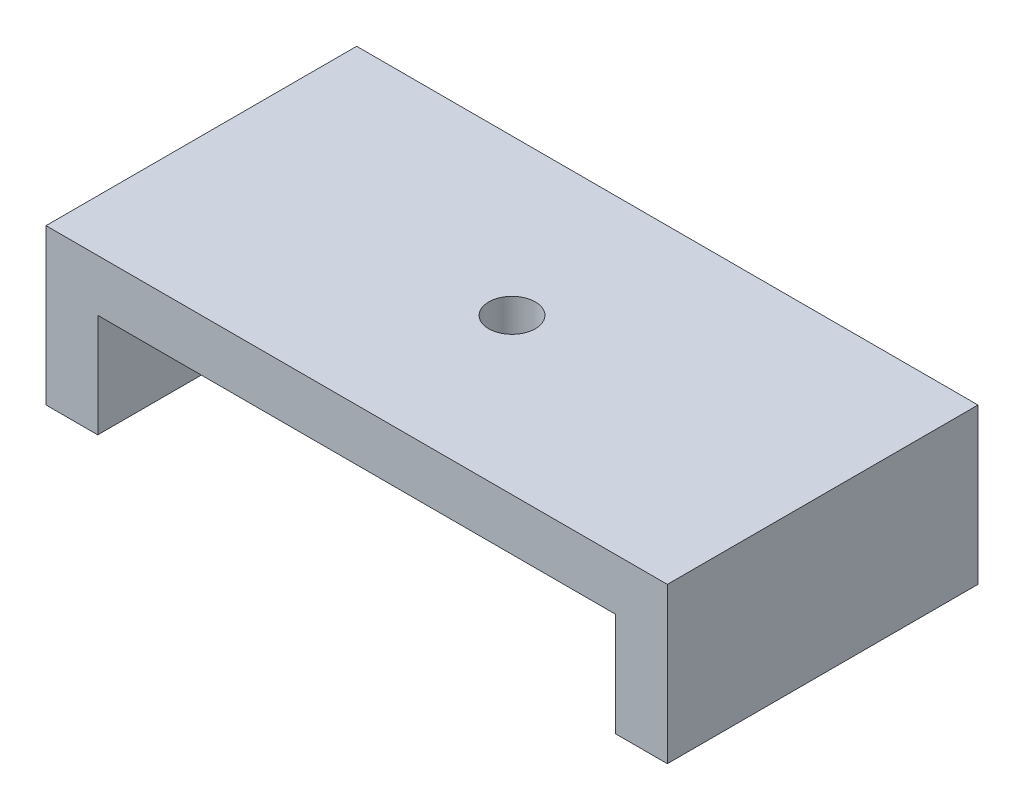
ISO-10303-21;
HEADER;
FILE_DESCRIPTION(('STEP AP214'),'2;1');
FILE_NAME('part.step','',(''),(''),'','','');
FILE_SCHEMA(('AUTOMOTIVE_DESIGN { 1 0 10303 214 1 1 1 1 }'));
ENDSEC;
DATA;
#1=APPLICATION_CONTEXT('core data for automotive mechanical design processes');
#2=APPLICATION_PROTOCOL_DEFINITION('international standard','automotive_design',2000,#1);
#3=PRODUCT_CONTEXT('',#1,'mechanical');
#4=PRODUCT('Part','Part','',(#3));
#5=PRODUCT_RELATED_PRODUCT_CATEGORY('part','',(#4));
#6=PRODUCT_DEFINITION_FORMATION('','',#4);
#7=PRODUCT_DEFINITION_CONTEXT('part definition',#1,'design');
#8=PRODUCT_DEFINITION('design','',#6,#7);
#9=PRODUCT_DEFINITION_SHAPE('','',#8);
#10=(LENGTH_UNIT() NAMED_UNIT(*) SI_UNIT(.MILLI.,.METRE.));
#11=(NAMED_UNIT(*) PLANE_ANGLE_UNIT() SI_UNIT($,.RADIAN.));
#12=(NAMED_UNIT(*) SI_UNIT($,.STERADIAN.) SOLID_ANGLE_UNIT());
#13=UNCERTAINTY_MEASURE_WITH_UNIT(LENGTH_MEASURE(1.E-05),#10,'distance_accuracy_value','');
#14=(GEOMETRIC_REPRESENTATION_CONTEXT(3) GLOBAL_UNCERTAINTY_ASSIGNED_CONTEXT((#13)) GLOBAL_UNIT_ASSIGNED_CONTEXT((#10,
#11,#12)) REPRESENTATION_CONTEXT('',''));
#15=CARTESIAN_POINT('',(0.,0.,0.));
#16=DIRECTION('',(0.,0.,1.));
#17=DIRECTION('',(1.,0.,0.));
#18=AXIS2_PLACEMENT_3D('',#15,#16,#17);
#19=CARTESIAN_POINT('',(0.,-15.,30.));
#20=DIRECTION('',(1.,0.,0.));
#21=DIRECTION('',(0.,0.,-1.));
#22=AXIS2_PLACEMENT_3D('',#19,#20,#21);
#23=PLANE('',#22);
#24=DIRECTION('',(0.,-1.,0.));
#25=VECTOR('',#24,1.);
#26=CARTESIAN_POINT('',(0.,-15.,0.));
#27=LINE('',#26,#25);
#28=CARTESIAN_POINT('',(0.,0.,0.));
#29=VERTEX_POINT('',#28);
#30=CARTESIAN_POINT('',(0.,-15.,0.));
#31=VERTEX_POINT('',#30);
#32=EDGE_CURVE('E133',#29,#31,#27,.T.);
#33=ORIENTED_EDGE('',*,*,#32,.T.);
#34=DIRECTION('',(0.,0.,-1.));
#35=VECTOR('',#34,1.);
#36=CARTESIAN_POINT('',(0.,-15.,30.));
#37=LINE('',#36,#35);
#38=CARTESIAN_POINT('',(0.,-15.,30.));
#39=VERTEX_POINT('',#38);
#40=EDGE_CURVE('E11',#39,#31,#37,.T.);
#41=ORIENTED_EDGE('',*,*,#40,.F.);
#42=DIRECTION('',(0.,-1.,0.));
#43=VECTOR('',#42,1.);
#44=CARTESIAN_POINT('',(0.,-15.,30.));
#45=LINE('',#44,#43);
#46=CARTESIAN_POINT('',(0.,0.,30.));
#47=VERTEX_POINT('',#46);
#48=EDGE_CURVE('E147',#47,#39,#45,.T.);
#49=ORIENTED_EDGE('',*,*,#48,.F.);
#50=DIRECTION('',(0.,0.,-1.));
#51=VECTOR('',#50,1.);
#52=CARTESIAN_POINT('',(0.,0.,30.));
#53=LINE('',#52,#51);
#54=EDGE_CURVE('E132',#47,#29,#53,.T.);
#55=ORIENTED_EDGE('',*,*,#54,.T.);
#56=EDGE_LOOP('',(#33,#41,#49,#55));
#57=FACE_BOUND('',#56,.T.);
#58=ADVANCED_FACE('F39',(#57),#23,.F.);
#59=CARTESIAN_POINT('',(5.,-15.,30.));
#60=DIRECTION('',(0.,1.,0.));
#61=DIRECTION('',(0.,0.,1.));
#62=AXIS2_PLACEMENT_3D('',#59,#60,#61);
#63=PLANE('',#62);
#64=DIRECTION('',(1.,0.,0.));
#65=VECTOR('',#64,1.);
#66=CARTESIAN_POINT('',(5.,-15.,0.));
#67=LINE('',#66,#65);
#68=CARTESIAN_POINT('',(5.,-15.,0.));
#69=VERTEX_POINT('',#68);
#70=EDGE_CURVE('E136',#31,#69,#67,.T.);
#71=ORIENTED_EDGE('',*,*,#70,.T.);
#72=DIRECTION('',(0.,0.,-1.));
#73=VECTOR('',#72,1.);
#74=CARTESIAN_POINT('',(5.,-15.,30.));
#75=LINE('',#74,#73);
#76=CARTESIAN_POINT('',(5.,-15.,30.));
#77=VERTEX_POINT('',#76);
#78=EDGE_CURVE('E50',#77,#69,#75,.T.);
#79=ORIENTED_EDGE('',*,*,#78,.F.);
#80=DIRECTION('',(1.,0.,0.));
#81=VECTOR('',#80,1.);
#82=CARTESIAN_POINT('',(5.,-15.,30.));
#83=LINE('',#82,#81);
#84=EDGE_CURVE('E98',#39,#77,#83,.T.);
#85=ORIENTED_EDGE('',*,*,#84,.F.);
#86=ORIENTED_EDGE('',*,*,#40,.T.);
#87=EDGE_LOOP('',(#71,#79,#85,#86));
#88=FACE_BOUND('',#87,.T.);
#89=ADVANCED_FACE('F202',(#88),#63,.F.);
#90=CARTESIAN_POINT('',(4.99999999999999,-5.,30.));
#91=DIRECTION('',(-1.,0.,0.));
#92=DIRECTION('',(0.,-1.,0.));
#93=AXIS2_PLACEMENT_3D('',#90,#91,#92);
#94=PLANE('',#93);
#95=DIRECTION('',(0.,1.,0.));
#96=VECTOR('',#95,1.);
#97=CARTESIAN_POINT('',(4.99999999999999,-5.,0.));
#98=LINE('',#97,#96);
#99=CARTESIAN_POINT('',(4.99999999999999,-5.,0.));
#100=VERTEX_POINT('',#99);
#101=EDGE_CURVE('E143',#69,#100,#98,.T.);
#102=ORIENTED_EDGE('',*,*,#101,.T.);
#103=DIRECTION('',(0.,0.,-1.));
#104=VECTOR('',#103,1.);
#105=CARTESIAN_POINT('',(4.99999999999999,-5.,30.));
#106=LINE('',#105,#104);
#107=CARTESIAN_POINT('',(4.99999999999999,-5.,30.));
#108=VERTEX_POINT('',#107);
#109=EDGE_CURVE('E160',#108,#100,#106,.T.);
#110=ORIENTED_EDGE('',*,*,#109,.F.);
#111=DIRECTION('',(0.,1.,0.));
#112=VECTOR('',#111,1.);
#113=CARTESIAN_POINT('',(4.99999999999999,-5.,30.));
#114=LINE('',#113,#112);
#115=EDGE_CURVE('E164',#77,#108,#114,.T.);
#116=ORIENTED_EDGE('',*,*,#115,.F.);
#117=ORIENTED_EDGE('',*,*,#78,.T.);
#118=EDGE_LOOP('',(#102,#110,#116,#117));
#119=FACE_BOUND('',#118,.T.);
#120=ADVANCED_FACE('F162',(#119),#94,.F.);
#121=CARTESIAN_POINT('',(55.,-5.00000000000001,30.));
#122=DIRECTION('',(0.,1.,0.));
#123=DIRECTION('',(-1.,0.,0.));
#124=AXIS2_PLACEMENT_3D('',#121,#122,#123);
#125=PLANE('',#124);
#126=CARTESIAN_POINT('',(30.,-5.,15.));
#127=DIRECTION('',(0.,1.,0.));
#128=DIRECTION('',(-1.,0.,0.));
#129=AXIS2_PLACEMENT_3D('',#126,#127,#128);
#130=CIRCLE('',#129,2.25);
#131=CARTESIAN_POINT('',(27.75,-5.,15.));
#132=VERTEX_POINT('',#131);
#133=EDGE_CURVE('E139',#132,#132,#130,.T.);
#134=ORIENTED_EDGE('',*,*,#133,.T.);
#135=EDGE_LOOP('',(#134));
#136=FACE_BOUND('',#135,.T.);
#137=DIRECTION('',(1.,0.,0.));
#138=VECTOR('',#137,1.);
#139=CARTESIAN_POINT('',(55.,-5.00000000000001,0.));
#140=LINE('',#139,#138);
#141=CARTESIAN_POINT('',(55.,-5.00000000000001,0.));
#142=VERTEX_POINT('',#141);
#143=EDGE_CURVE('E141',#100,#142,#140,.T.);
#144=ORIENTED_EDGE('',*,*,#143,.T.);
#145=DIRECTION('',(0.,0.,-1.));
#146=VECTOR('',#145,1.);
#147=CARTESIAN_POINT('',(55.,-5.00000000000001,30.));
#148=LINE('',#147,#146);
#149=CARTESIAN_POINT('',(55.,-5.00000000000001,30.));
#150=VERTEX_POINT('',#149);
#151=EDGE_CURVE('E152',#150,#142,#148,.T.);
#152=ORIENTED_EDGE('',*,*,#151,.F.);
#153=DIRECTION('',(1.,0.,0.));
#154=VECTOR('',#153,1.);
#155=CARTESIAN_POINT('',(55.,-5.00000000000001,30.));
#156=LINE('',#155,#154);
#157=EDGE_CURVE('E180',#108,#150,#156,.T.);
#158=ORIENTED_EDGE('',*,*,#157,.F.);
#159=ORIENTED_EDGE('',*,*,#109,.T.);
#160=EDGE_LOOP('',(#144,#152,#158,#159));
#161=FACE_BOUND('',#160,.T.);
#162=ADVANCED_FACE('F174',(#136,#161),#125,.F.);
#163=CARTESIAN_POINT('',(55.,-15.,30.));
#164=DIRECTION('',(1.,0.,0.));
#165=DIRECTION('',(0.,0.,-1.));
#166=AXIS2_PLACEMENT_3D('',#163,#164,#165);
#167=PLANE('',#166);
#168=DIRECTION('',(0.,-1.,0.));
#169=VECTOR('',#168,1.);
#170=CARTESIAN_POINT('',(55.,-15.,0.));
#171=LINE('',#170,#169);
#172=CARTESIAN_POINT('',(55.,-15.,0.));
#173=VERTEX_POINT('',#172);
#174=EDGE_CURVE('E144',#142,#173,#171,.T.);
#175=ORIENTED_EDGE('',*,*,#174,.T.);
#176=DIRECTION('',(0.,0.,-1.));
#177=VECTOR('',#176,1.);
#178=CARTESIAN_POINT('',(55.,-15.,30.));
#179=LINE('',#178,#177);
#180=CARTESIAN_POINT('',(55.,-15.,30.));
#181=VERTEX_POINT('',#180);
#182=EDGE_CURVE('E127',#181,#173,#179,.T.);
#183=ORIENTED_EDGE('',*,*,#182,.F.);
#184=DIRECTION('',(0.,-1.,0.));
#185=VECTOR('',#184,1.);
#186=CARTESIAN_POINT('',(55.,-15.,30.));
#187=LINE('',#186,#185);
#188=EDGE_CURVE('E120',#150,#181,#187,.T.);
#189=ORIENTED_EDGE('',*,*,#188,.F.);
#190=ORIENTED_EDGE('',*,*,#151,.T.);
#191=EDGE_LOOP('',(#175,#183,#189,#190));
#192=FACE_BOUND('',#191,.T.);
#193=ADVANCED_FACE('F178',(#192),#167,.F.);
#194=CARTESIAN_POINT('',(60.,-15.,30.));
#195=DIRECTION('',(0.,1.,0.));
#196=DIRECTION('',(-1.,0.,0.));
#197=AXIS2_PLACEMENT_3D('',#194,#195,#196);
#198=PLANE('',#197);
#199=DIRECTION('',(1.,0.,0.));
#200=VECTOR('',#199,1.);
#201=CARTESIAN_POINT('',(60.,-15.,0.));
#202=LINE('',#201,#200);
#203=CARTESIAN_POINT('',(60.,-15.,0.));
#204=VERTEX_POINT('',#203);
#205=EDGE_CURVE('E122',#173,#204,#202,.T.);
#206=ORIENTED_EDGE('',*,*,#205,.T.);
#207=DIRECTION('',(0.,0.,-1.));
#208=VECTOR('',#207,1.);
#209=CARTESIAN_POINT('',(60.,-15.,30.));
#210=LINE('',#209,#208);
#211=CARTESIAN_POINT('',(60.,-15.,30.));
#212=VERTEX_POINT('',#211);
#213=EDGE_CURVE('E125',#212,#204,#210,.T.);
#214=ORIENTED_EDGE('',*,*,#213,.F.);
#215=DIRECTION('',(1.,0.,0.));
#216=VECTOR('',#215,1.);
#217=CARTESIAN_POINT('',(60.,-15.,30.));
#218=LINE('',#217,#216);
#219=EDGE_CURVE('E112',#181,#212,#218,.T.);
#220=ORIENTED_EDGE('',*,*,#219,.F.);
#221=ORIENTED_EDGE('',*,*,#182,.T.);
#222=EDGE_LOOP('',(#206,#214,#220,#221));
#223=FACE_BOUND('',#222,.T.);
#224=ADVANCED_FACE('F121',(#223),#198,.F.);
#225=CARTESIAN_POINT('',(60.,0.,30.));
#226=DIRECTION('',(-1.,0.,0.));
#227=DIRECTION('',(0.,0.,1.));
#228=AXIS2_PLACEMENT_3D('',#225,#226,#227);
#229=PLANE('',#228);
#230=DIRECTION('',(0.,1.,0.));
#231=VECTOR('',#230,1.);
#232=CARTESIAN_POINT('',(60.,0.,0.));
#233=LINE('',#232,#231);
#234=CARTESIAN_POINT('',(60.,0.,0.));
#235=VERTEX_POINT('',#234);
#236=EDGE_CURVE('E84',#204,#235,#233,.T.);
#237=ORIENTED_EDGE('',*,*,#236,.T.);
#238=DIRECTION('',(0.,0.,-1.));
#239=VECTOR('',#238,1.);
#240=CARTESIAN_POINT('',(60.,0.,30.));
#241=LINE('',#240,#239);
#242=CARTESIAN_POINT('',(60.,0.,30.));
#243=VERTEX_POINT('',#242);
#244=EDGE_CURVE('E130',#243,#235,#241,.T.);
#245=ORIENTED_EDGE('',*,*,#244,.F.);
#246=DIRECTION('',(0.,1.,0.));
#247=VECTOR('',#246,1.);
#248=CARTESIAN_POINT('',(60.,0.,30.));
#249=LINE('',#248,#247);
#250=EDGE_CURVE('E113',#212,#243,#249,.T.);
#251=ORIENTED_EDGE('',*,*,#250,.F.);
#252=ORIENTED_EDGE('',*,*,#213,.T.);
#253=EDGE_LOOP('',(#237,#245,#251,#252));
#254=FACE_BOUND('',#253,.T.);
#255=ADVANCED_FACE('F129',(#254),#229,.F.);
#256=CARTESIAN_POINT('',(0.,0.,30.));
#257=DIRECTION('',(0.,-1.,0.));
#258=DIRECTION('',(0.,0.,-1.));
#259=AXIS2_PLACEMENT_3D('',#256,#257,#258);
#260=PLANE('',#259);
#261=CARTESIAN_POINT('',(30.,0.,15.));
#262=DIRECTION('',(0.,1.,0.));
#263=DIRECTION('',(0.,0.,1.));
#264=AXIS2_PLACEMENT_3D('',#261,#262,#263);
#265=CIRCLE('',#264,2.25);
#266=CARTESIAN_POINT('',(30.,0.,17.25));
#267=VERTEX_POINT('',#266);
#268=EDGE_CURVE('E183',#267,#267,#265,.T.);
#269=ORIENTED_EDGE('',*,*,#268,.F.);
#270=EDGE_LOOP('',(#269));
#271=FACE_BOUND('',#270,.T.);
#272=DIRECTION('',(-1.,0.,0.));
#273=VECTOR('',#272,1.);
#274=CARTESIAN_POINT('',(0.,0.,0.));
#275=LINE('',#274,#273);
#276=EDGE_CURVE('E89',#235,#29,#275,.T.);
#277=ORIENTED_EDGE('',*,*,#276,.T.);
#278=ORIENTED_EDGE('',*,*,#54,.F.);
#279=DIRECTION('',(-1.,0.,0.));
#280=VECTOR('',#279,1.);
#281=CARTESIAN_POINT('',(0.,0.,30.));
#282=LINE('',#281,#280);
#283=EDGE_CURVE('E54',#243,#47,#282,.T.);
#284=ORIENTED_EDGE('',*,*,#283,.F.);
#285=ORIENTED_EDGE('',*,*,#244,.T.);
#286=EDGE_LOOP('',(#277,#278,#284,#285));
#287=FACE_BOUND('',#286,.T.);
#288=ADVANCED_FACE('F195',(#271,#287),#260,.F.);
#289=CARTESIAN_POINT('',(0.,0.,30.));
#290=DIRECTION('',(0.,0.,-1.));
#291=DIRECTION('',(-1.,0.,0.));
#292=AXIS2_PLACEMENT_3D('',#289,#290,#291);
#293=PLANE('',#292);
#294=ORIENTED_EDGE('',*,*,#48,.T.);
#295=ORIENTED_EDGE('',*,*,#84,.T.);
#296=ORIENTED_EDGE('',*,*,#115,.T.);
#297=ORIENTED_EDGE('',*,*,#157,.T.);
#298=ORIENTED_EDGE('',*,*,#188,.T.);
#299=ORIENTED_EDGE('',*,*,#219,.T.);
#300=ORIENTED_EDGE('',*,*,#250,.T.);
#301=ORIENTED_EDGE('',*,*,#283,.T.);
#302=EDGE_LOOP('',(#294,#295,#296,#297,#298,#299,#300,#301));
#303=FACE_BOUND('',#302,.T.);
#304=ADVANCED_FACE('F114',(#303),#293,.F.);
#305=CARTESIAN_POINT('',(0.,0.,0.));
#306=DIRECTION('',(0.,0.,-1.));
#307=DIRECTION('',(-1.,0.,0.));
#308=AXIS2_PLACEMENT_3D('',#305,#306,#307);
#309=PLANE('',#308);
#310=ORIENTED_EDGE('',*,*,#32,.F.);
#311=ORIENTED_EDGE('',*,*,#276,.F.);
#312=ORIENTED_EDGE('',*,*,#236,.F.);
#313=ORIENTED_EDGE('',*,*,#205,.F.);
#314=ORIENTED_EDGE('',*,*,#174,.F.);
#315=ORIENTED_EDGE('',*,*,#143,.F.);
#316=ORIENTED_EDGE('',*,*,#101,.F.);
#317=ORIENTED_EDGE('',*,*,#70,.F.);
#318=EDGE_LOOP('',(#310,#311,#312,#313,#314,#315,#316,#317));
#319=FACE_BOUND('',#318,.T.);
#320=ADVANCED_FACE('F166',(#319),#309,.T.);
#321=CARTESIAN_POINT('',(30.,-15.,15.));
#322=DIRECTION('',(0.,1.,0.));
#323=DIRECTION('',(0.,0.,1.));
#324=AXIS2_PLACEMENT_3D('',#321,#322,#323);
#325=CYLINDRICAL_SURFACE('',#324,2.25);
#326=ORIENTED_EDGE('',*,*,#268,.T.);
#327=EDGE_LOOP('',(#326));
#328=FACE_BOUND('',#327,.T.);
#329=ORIENTED_EDGE('',*,*,#133,.F.);
#330=EDGE_LOOP('',(#329));
#331=FACE_BOUND('',#330,.T.);
#332=ADVANCED_FACE('F186',(#328,#331),#325,.F.);
#333=CLOSED_SHELL('',(#58,#89,#120,#162,#193,#224,#255,#288,#304,#320,#332));
#334=MANIFOLD_SOLID_BREP('B2',#333);
#335=ADVANCED_BREP_SHAPE_REPRESENTATION('',(#18,#334),#14);
#336=SHAPE_DEFINITION_REPRESENTATION(#9,#335);
ENDSEC;
END-ISO-10303-21;
